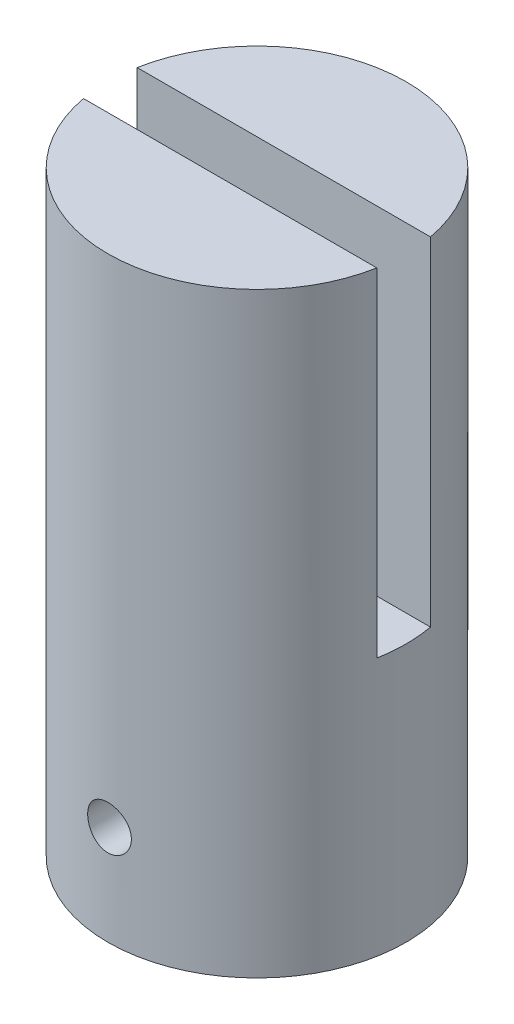
ISO-10303-21;
HEADER;
FILE_DESCRIPTION(('STEP AP214'),'2;1');
FILE_NAME('part.step','',(''),(''),'','','');
FILE_SCHEMA(('AUTOMOTIVE_DESIGN { 1 0 10303 214 1 1 1 1 }'));
ENDSEC;
DATA;
#1=APPLICATION_CONTEXT('core data for automotive mechanical design processes');
#2=APPLICATION_PROTOCOL_DEFINITION('international standard','automotive_design',2000,#1);
#3=PRODUCT_CONTEXT('',#1,'mechanical');
#4=PRODUCT('Part','Part','',(#3));
#5=PRODUCT_RELATED_PRODUCT_CATEGORY('part','',(#4));
#6=PRODUCT_DEFINITION_FORMATION('','',#4);
#7=PRODUCT_DEFINITION_CONTEXT('part definition',#1,'design');
#8=PRODUCT_DEFINITION('design','',#6,#7);
#9=PRODUCT_DEFINITION_SHAPE('','',#8);
#10=(LENGTH_UNIT() NAMED_UNIT(*) SI_UNIT(.MILLI.,.METRE.));
#11=(NAMED_UNIT(*) PLANE_ANGLE_UNIT() SI_UNIT($,.RADIAN.));
#12=(NAMED_UNIT(*) SI_UNIT($,.STERADIAN.) SOLID_ANGLE_UNIT());
#13=UNCERTAINTY_MEASURE_WITH_UNIT(LENGTH_MEASURE(1.E-05),#10,'distance_accuracy_value','');
#14=(GEOMETRIC_REPRESENTATION_CONTEXT(3) GLOBAL_UNCERTAINTY_ASSIGNED_CONTEXT((#13)) GLOBAL_UNIT_ASSIGNED_CONTEXT((#10,
#11,#12)) REPRESENTATION_CONTEXT('',''));
#15=CARTESIAN_POINT('',(0.,0.,0.));
#16=DIRECTION('',(0.,0.,1.));
#17=DIRECTION('',(1.,0.,0.));
#18=AXIS2_PLACEMENT_3D('',#15,#16,#17);
#19=CARTESIAN_POINT('',(0.,20.,0.));
#20=DIRECTION('',(0.,1.,0.));
#21=DIRECTION('',(0.,0.,1.));
#22=AXIS2_PLACEMENT_3D('',#19,#20,#21);
#23=PLANE('',#22);
#24=DIRECTION('',(-1.,0.,0.));
#25=VECTOR('',#24,1.);
#26=CARTESIAN_POINT('',(-7.37749957641476,20.,-1.35));
#27=LINE('',#26,#25);
#28=CARTESIAN_POINT('',(7.37749957641476,20.,-1.35));
#29=VERTEX_POINT('',#28);
#30=CARTESIAN_POINT('',(-7.37749957641476,20.,-1.35));
#31=VERTEX_POINT('',#30);
#32=EDGE_CURVE('E89',#29,#31,#27,.T.);
#33=ORIENTED_EDGE('',*,*,#32,.F.);
#34=CARTESIAN_POINT('',(0.,20.,0.));
#35=DIRECTION('',(0.,1.,0.));
#36=DIRECTION('',(0.,0.,1.));
#37=AXIS2_PLACEMENT_3D('',#34,#35,#36);
#38=CIRCLE('',#37,7.5);
#39=EDGE_CURVE('E138',#29,#31,#38,.T.);
#40=ORIENTED_EDGE('',*,*,#39,.T.);
#41=EDGE_LOOP('',(#33,#40));
#42=FACE_BOUND('',#41,.T.);
#43=ADVANCED_FACE('F45',(#42),#23,.T.);
#44=CARTESIAN_POINT('',(0.,-10.,0.));
#45=DIRECTION('',(0.,1.,0.));
#46=DIRECTION('',(0.,0.,1.));
#47=AXIS2_PLACEMENT_3D('',#44,#45,#46);
#48=CYLINDRICAL_SURFACE('',#47,2.5);
#49=CARTESIAN_POINT('',(0.,-6.1,2.5));
#50=CARTESIAN_POINT('',(0.0586367218408859,-6.09999303754305,2.49999465716921));
#51=CARTESIAN_POINT('',(0.117350039514211,-6.09528424770001,2.49791375617732));
#52=CARTESIAN_POINT('',(0.233099616617565,-6.07662392388924,2.48978963586581));
#53=CARTESIAN_POINT('',(0.290131432410816,-6.06264985599233,2.48373675673411));
#54=CARTESIAN_POINT('',(0.400648928249893,-6.02608721324461,2.46831559920335));
#55=CARTESIAN_POINT('',(0.454146383103754,-6.00352913199039,2.45895906500054));
#56=CARTESIAN_POINT('',(0.55654046054891,-5.95057222224762,2.43782683007672));
#57=CARTESIAN_POINT('',(0.605438183509771,-5.92017527555283,2.42605171009798));
#58=CARTESIAN_POINT('',(0.700001144236969,-5.85065400836642,2.40052408725658));
#59=CARTESIAN_POINT('',(0.745382457137743,-5.81116927213135,2.38670214750626));
#60=CARTESIAN_POINT('',(0.829128369829129,-5.72535787012568,2.35891853478619));
#61=CARTESIAN_POINT('',(0.86748886949951,-5.67902723474457,2.34495678515567));
#62=CARTESIAN_POINT('',(0.938247991654476,-5.57768499315168,2.31758746970848));
#63=CARTESIAN_POINT('',(0.970189247297979,-5.52233146084711,2.30425538414495));
#64=CARTESIAN_POINT('',(1.02418114955138,-5.40637017403964,2.28077315587808));
#65=CARTESIAN_POINT('',(1.0462374610425,-5.34576545272414,2.27062119171201));
#66=CARTESIAN_POINT('',(1.07862747820579,-5.22428751605859,2.25540902073449));
#67=CARTESIAN_POINT('',(1.08951044424758,-5.16359166760425,2.25011178233037));
#68=CARTESIAN_POINT('',(1.10095369826767,-5.04102223082931,2.24453690633814));
#69=CARTESIAN_POINT('',(1.10152067171218,-4.97914943128522,2.24425601781561));
#70=CARTESIAN_POINT('',(1.09272613127389,-4.86176275096281,2.24854737601977));
#71=CARTESIAN_POINT('',(1.08422761243453,-4.80616554013494,2.25269781148248));
#72=CARTESIAN_POINT('',(1.05900347128123,-4.69728584959256,2.26466430921562));
#73=CARTESIAN_POINT('',(1.04227604774947,-4.6440038794393,2.27248117401014));
#74=CARTESIAN_POINT('',(1.00073766420331,-4.53984871594457,2.29108049051599));
#75=CARTESIAN_POINT('',(0.975754853135299,-4.48905567399721,2.30192515424446));
#76=CARTESIAN_POINT('',(0.918538071138383,-4.39217074774947,2.32534772681104));
#77=CARTESIAN_POINT('',(0.88630107487799,-4.34608083656255,2.33792635794357));
#78=CARTESIAN_POINT('',(0.811891845979586,-4.25528801109822,2.36485507398313));
#79=CARTESIAN_POINT('',(0.76906566316889,-4.21113560599842,2.37925975443799));
#80=CARTESIAN_POINT('',(0.676492059688758,-4.13044259291211,2.4072173289364));
#81=CARTESIAN_POINT('',(0.626742634748407,-4.09390419685027,2.42076997466146));
#82=CARTESIAN_POINT('',(0.519896961156606,-4.02853873306688,2.44597634517675));
#83=CARTESIAN_POINT('',(0.462632077104509,-3.99996037893763,2.45756514374559));
#84=CARTESIAN_POINT('',(0.34346659465005,-3.95304061298761,2.4770275389561));
#85=CARTESIAN_POINT('',(0.281568886783102,-3.93469287742953,2.48490343014915));
#86=CARTESIAN_POINT('',(0.159473485006452,-3.90996463944416,2.49560863731161));
#87=CARTESIAN_POINT('',(0.0994523604133099,-3.90284689031869,2.49874819192128));
#88=CARTESIAN_POINT('',(-0.0210050155627028,-3.89855218725717,2.5006363719003));
#89=CARTESIAN_POINT('',(-0.0814411230661712,-3.90137194595955,2.49938644932419));
#90=CARTESIAN_POINT('',(-0.197395564749818,-3.91636745443862,2.49283358306434));
#91=CARTESIAN_POINT('',(-0.252998460268493,-3.92800374945377,2.48776442279183));
#92=CARTESIAN_POINT('',(-0.361388625268707,-3.95952648520691,2.47434485753276));
#93=CARTESIAN_POINT('',(-0.414175549285706,-3.97941393558514,2.46599405099908));
#94=CARTESIAN_POINT('',(-0.517306134249112,-4.02751180281109,2.44647422999304));
#95=CARTESIAN_POINT('',(-0.567521975819027,-4.05596278950484,2.43522533453316));
#96=CARTESIAN_POINT('',(-0.662647931848933,-4.12011780412387,2.41108068156595));
#97=CARTESIAN_POINT('',(-0.70755573255054,-4.15582497669157,2.39818421094523));
#98=CARTESIAN_POINT('',(-0.794535921084732,-4.23677307617851,2.37085476506779));
#99=CARTESIAN_POINT('',(-0.836102677071006,-4.28254485504362,2.3563809618822));
#100=CARTESIAN_POINT('',(-0.911130364291372,-4.38060186209504,2.32840043164694));
#101=CARTESIAN_POINT('',(-0.944588603277077,-4.43288924493781,2.31489402684557));
#102=CARTESIAN_POINT('',(-1.00306461500776,-4.54405227248348,2.29017357162823));
#103=CARTESIAN_POINT('',(-1.02788184272011,-4.60304697145719,2.27901610024637));
#104=CARTESIAN_POINT('',(-1.0669970798892,-4.72502869073128,2.26097093531371));
#105=CARTESIAN_POINT('',(-1.08130511881295,-4.78801184211108,2.25407917176632));
#106=CARTESIAN_POINT('',(-1.09794749998744,-4.91051377364932,2.24601624579395));
#107=CARTESIAN_POINT('',(-1.10118265331803,-4.96988212983158,2.24441509875159));
#108=CARTESIAN_POINT('',(-1.09804797544474,-5.08829554931592,2.24595065931745));
#109=CARTESIAN_POINT('',(-1.09168008522386,-5.14734067552901,2.24908640949641));
#110=CARTESIAN_POINT('',(-1.0703038985897,-5.25988942044146,2.2593308804113));
#111=CARTESIAN_POINT('',(-1.0558164292123,-5.31351605911872,2.26619942385352));
#112=CARTESIAN_POINT('',(-1.01915514976327,-5.41757418673947,2.2829205949874));
#113=CARTESIAN_POINT('',(-0.996979128423342,-5.46800475153443,2.29277408106133));
#114=CARTESIAN_POINT('',(-0.943956611645528,-5.56774649245633,2.31512904717081));
#115=CARTESIAN_POINT('',(-0.912648777587145,-5.61678300376447,2.32775898670394));
#116=CARTESIAN_POINT('',(-0.842858154954993,-5.70918660820952,2.35392825284202));
#117=CARTESIAN_POINT('',(-0.804372446896091,-5.75255138220496,2.36746794803684));
#118=CARTESIAN_POINT('',(-0.717447247329579,-5.83618671892077,2.39531255770243));
#119=CARTESIAN_POINT('',(-0.668439664484218,-5.87588072076266,2.40958465591957));
#120=CARTESIAN_POINT('',(-0.563953859058426,-5.94653695946252,2.4361563814722));
#121=CARTESIAN_POINT('',(-0.508472708062032,-5.97749522276229,2.44845511010259));
#122=CARTESIAN_POINT('',(-0.393174205565595,-6.0292517525901,2.46957634083649));
#123=CARTESIAN_POINT('',(-0.333418590724998,-6.05017031601379,2.47843974411015));
#124=CARTESIAN_POINT('',(-0.210859953188953,-6.08143963656917,2.49184807766586));
#125=CARTESIAN_POINT('',(-0.148066893788328,-6.09182277592608,2.49640623776158));
#126=CARTESIAN_POINT('',(-0.0566361036605752,-6.09890941998446,2.49952077080228));
#127=CARTESIAN_POINT('',(-0.0283269897537342,-6.1000033635142,2.50000258108415));
#128=CARTESIAN_POINT('',(0.,-6.1,2.5));
#129=B_SPLINE_CURVE_WITH_KNOTS('',3,(#49,#50,#51,#52,#53,#54,#55,#56,#57,#58,#59,#60,#61,#62,
#63,#64,#65,#66,#67,#68,#69,#70,#71,#72,#73,#74,#75,#76,#77,#78,#79,#80,#81,#82,#83,#84,#85,#86,
#87,#88,#89,#90,#91,#92,#93,#94,#95,#96,#97,#98,#99,#100,#101,#102,#103,#104,#105,#106,#107,
#108,#109,#110,#111,#112,#113,#114,#115,#116,#117,#118,#119,#120,#121,#122,#123,#124,#125,#126,
#127,#128),.UNSPECIFIED.,.T.,.F.,(4,2,2,2,2,2,2,2,2,2,2,2,2,2,2,2,2,2,2,2,2,2,2,2,2,2,2,2,2,2,2,
2,2,2,2,2,2,2,2,4),(0.,0.175823006765325,0.352075206033633,0.52770705040205,0.703296771869916,
0.887667196439057,1.07214495123452,1.26701099730957,1.46176522595861,1.64640617200027,
1.83092745386095,1.99932953094852,2.16776848583312,2.33996148471304,2.51222642958632,
2.70090374625017,2.88963579885964,3.08373249775163,3.27770908845655,3.45832470157031,
3.63888057203061,3.80920070013579,3.97954167535736,4.1552033636875,4.33094134220297,
4.52058675503902,4.71029504931062,4.90415128828871,5.09782227890324,5.27530624846021,
5.45275434947241,5.61994334896612,5.78718047284463,5.96504237618469,6.1429767803923,
6.33603973003759,6.5291903557019,6.71996496949548,6.91015141588824,6.99509027936405),.UNSPECIFIED.);
#130=CARTESIAN_POINT('',(0.,-6.1,2.5));
#131=VERTEX_POINT('',#130);
#132=EDGE_CURVE('E126',#131,#131,#129,.T.);
#133=ORIENTED_EDGE('',*,*,#132,.T.);
#134=EDGE_LOOP('',(#133));
#135=FACE_BOUND('',#134,.T.);
#136=CARTESIAN_POINT('',(1.1,-5.,-2.24499443206436));
#137=CARTESIAN_POINT('',(1.09999264071967,-5.05832534530599,-2.24500186891575));
#138=CARTESIAN_POINT('',(1.09533182245849,-5.11673095665704,-2.2473008014463));
#139=CARTESIAN_POINT('',(1.07687935781384,-5.2318356309388,-2.2561976772502));
#140=CARTESIAN_POINT('',(1.06306428213531,-5.2885299236318,-2.26280665090222));
#141=CARTESIAN_POINT('',(1.02696546928901,-5.39832938440307,-2.27941479604708));
#142=CARTESIAN_POINT('',(1.00471896027897,-5.45144913852327,-2.28939904371374));
#143=CARTESIAN_POINT('',(0.952498974806719,-5.55318908175269,-2.31161149325762));
#144=CARTESIAN_POINT('',(0.922526710535582,-5.60180997511992,-2.32383934302118));
#145=CARTESIAN_POINT('',(0.853478204326694,-5.69658108301255,-2.35011094846474));
#146=CARTESIAN_POINT('',(0.813946593299058,-5.74238141024933,-2.36422061386325));
#147=CARTESIAN_POINT('',(0.727855362180884,-5.82696454630179,-2.39212743157456));
#148=CARTESIAN_POINT('',(0.681292858785606,-5.86574446169749,-2.40592445299291));
#149=CARTESIAN_POINT('',(0.579643227927882,-5.93704472624726,-2.43246847746696));
#150=CARTESIAN_POINT('',(0.524248796898383,-5.96916168762396,-2.44513005272046));
#151=CARTESIAN_POINT('',(0.408184216492102,-6.02346689815691,-2.46715746778218));
#152=CARTESIAN_POINT('',(0.347516683060515,-6.04566003724484,-2.47652493026685));
#153=CARTESIAN_POINT('',(0.226310849545847,-6.07818921438298,-2.49043942220434));
#154=CARTESIAN_POINT('',(0.165963932126523,-6.08913124957504,-2.49523168581752));
#155=CARTESIAN_POINT('',(0.0441134537254011,-6.10081566660431,-2.5003531145501));
#156=CARTESIAN_POINT('',(-0.0173895674937781,-6.10156269539892,-2.50068431305423));
#157=CARTESIAN_POINT('',(-0.135361763608586,-6.09313174808474,-2.49698346578356));
#158=CARTESIAN_POINT('',(-0.191889766863561,-6.0846225000889,-2.49324539438955));
#159=CARTESIAN_POINT('',(-0.302619645234444,-6.05908000760638,-2.48224055592851));
#160=CARTESIAN_POINT('',(-0.356821347840335,-6.04204613214601,-2.47497352765724));
#161=CARTESIAN_POINT('',(-0.462364843718385,-5.99975081585187,-2.4574634692465));
#162=CARTESIAN_POINT('',(-0.513650307195615,-5.97436767675258,-2.44717667746158));
#163=CARTESIAN_POINT('',(-0.611368753826889,-5.91622273749278,-2.42461273867786));
#164=CARTESIAN_POINT('',(-0.657799964862745,-5.88345825633757,-2.41233486895002));
#165=CARTESIAN_POINT('',(-0.748309969403563,-5.80854467466483,-2.3858801337429));
#166=CARTESIAN_POINT('',(-0.791929518202139,-5.7658659371704,-2.37162983972768));
#167=CARTESIAN_POINT('',(-0.871604932828498,-5.67380525175017,-2.34352160386143));
#168=CARTESIAN_POINT('',(-0.907657178035842,-5.62442011363417,-2.32966385255521));
#169=CARTESIAN_POINT('',(-0.972551863960967,-5.51786697337761,-2.30334986356432));
#170=CARTESIAN_POINT('',(-1.00104660738835,-5.4604660589339,-2.29097226218579));
#171=CARTESIAN_POINT('',(-1.0477731426051,-5.34099363699715,-2.2699857105531));
#172=CARTESIAN_POINT('',(-1.06601324561569,-5.27892595823709,-2.26137370960231));
#173=CARTESIAN_POINT('',(-1.09047181528063,-5.15649635690884,-2.24967637482319));
#174=CARTESIAN_POINT('',(-1.09744082962861,-5.09631799210515,-2.24624709890656));
#175=CARTESIAN_POINT('',(-1.10138444364863,-4.97556678141091,-2.24431716581293));
#176=CARTESIAN_POINT('',(-1.09836322284601,-4.9149941110651,-2.24581444755476));
#177=CARTESIAN_POINT('',(-1.08309883991271,-4.79997445108104,-2.2532104139799));
#178=CARTESIAN_POINT('',(-1.07156417098469,-4.74540871176996,-2.25877064140546));
#179=CARTESIAN_POINT('',(-1.04056836908943,-4.63904589266692,-2.2732152516958));
#180=CARTESIAN_POINT('',(-1.02110523508159,-4.58724951556178,-2.28210047369949));
#181=CARTESIAN_POINT('',(-0.973855802064503,-4.48531502410598,-2.30267121517148));
#182=CARTESIAN_POINT('',(-0.945738180525618,-4.43535278150715,-2.31446359544008));
#183=CARTESIAN_POINT('',(-0.88229515910368,-4.34059897112326,-2.33938364186295));
#184=CARTESIAN_POINT('',(-0.846966407868071,-4.29580982272973,-2.35251192744771));
#185=CARTESIAN_POINT('',(-0.766250940130195,-4.20834348326937,-2.38009237517463));
#186=CARTESIAN_POINT('',(-0.720235306799715,-4.16624735384173,-2.39455440317886));
#187=CARTESIAN_POINT('',(-0.621478409089594,-4.09024918917781,-2.42206311373892));
#188=CARTESIAN_POINT('',(-0.568736277320656,-4.0563482123507,-2.43510961335855));
#189=CARTESIAN_POINT('',(-0.457328840448396,-3.9975812463636,-2.45847705567111));
#190=CARTESIAN_POINT('',(-0.398622234619679,-3.972784635954,-2.46877691176735));
#191=CARTESIAN_POINT('',(-0.277295435121193,-3.93362148928049,-2.48532596548122));
#192=CARTESIAN_POINT('',(-0.214677899404982,-3.91924795126829,-2.49157788201844));
#193=CARTESIAN_POINT('',(-0.0924681222925543,-3.90229273779352,-2.49898163891922));
#194=CARTESIAN_POINT('',(-0.0330099164450834,-3.89889454314046,-2.50048642500148));
#195=CARTESIAN_POINT('',(0.0856232403929806,-3.90173467433723,-2.49923675127029));
#196=CARTESIAN_POINT('',(0.144798249098678,-3.9079709447969,-2.49648319991867));
#197=CARTESIAN_POINT('',(0.258552884051377,-3.92931917911344,-2.48722160837499));
#198=CARTESIAN_POINT('',(0.313220762920489,-3.9440392317527,-2.48087956206805));
#199=CARTESIAN_POINT('',(0.419273041124582,-3.98148424929485,-2.46517470655145));
#200=CARTESIAN_POINT('',(0.470656854374071,-4.0042106383491,-2.45581135994377));
#201=CARTESIAN_POINT('',(0.571286976441056,-4.0581723526588,-2.43441956507932));
#202=CARTESIAN_POINT('',(0.620327472114033,-4.08974983811884,-2.42228866159088));
#203=CARTESIAN_POINT('',(0.71262843809811,-4.16004201887515,-2.39675984874361));
#204=CARTESIAN_POINT('',(0.755886490574643,-4.19875968371979,-2.38336141336083));
#205=CARTESIAN_POINT('',(0.838875102840799,-4.28573536284001,-2.35549351893128));
#206=CARTESIAN_POINT('',(0.878076999318062,-4.33449862675056,-2.34102108586691));
#207=CARTESIAN_POINT('',(0.947850118274262,-4.43831346571325,-2.31365292914796));
#208=CARTESIAN_POINT('',(0.978416065426935,-4.49336885563961,-2.30075817194161));
#209=CARTESIAN_POINT('',(1.02994457246076,-4.60858461437734,-2.27815955688964));
#210=CARTESIAN_POINT('',(1.05088627507499,-4.66875573874873,-2.26846264199146));
#211=CARTESIAN_POINT('',(1.08206209910023,-4.79223462376859,-2.25376370647696));
#212=CARTESIAN_POINT('',(1.09233214658097,-4.85553110398974,-2.24874593942601));
#213=CARTESIAN_POINT('',(1.09901270586322,-4.94610163272641,-2.24547707915797));
#214=CARTESIAN_POINT('',(1.10000340143192,-4.97304224293052,-2.24499099477939));
#215=CARTESIAN_POINT('',(1.1,-5.,-2.24499443206436));
#216=B_SPLINE_CURVE_WITH_KNOTS('',3,(#136,#137,#138,#139,#140,#141,#142,#143,#144,#145,#146,
#147,#148,#149,#150,#151,#152,#153,#154,#155,#156,#157,#158,#159,#160,#161,#162,#163,#164,#165,
#166,#167,#168,#169,#170,#171,#172,#173,#174,#175,#176,#177,#178,#179,#180,#181,#182,#183,#184,
#185,#186,#187,#188,#189,#190,#191,#192,#193,#194,#195,#196,#197,#198,#199,#200,#201,#202,#203,
#204,#205,#206,#207,#208,#209,#210,#211,#212,#213,#214,#215),.UNSPECIFIED.,.T.,.F.,(4,2,2,2,2,2,
2,2,2,2,2,2,2,2,2,2,2,2,2,2,2,2,2,2,2,2,2,2,2,2,2,2,2,2,2,2,2,2,2,4),(0.,0.174891994667566,
0.350233343674121,0.524809343440101,0.699357968434042,0.884928681651847,1.07057570344715,
1.26538500767087,1.46009821416859,1.64366581372382,1.82714973904773,1.99820752306006,
2.16927797025682,2.34296144404577,2.51670810381827,2.70388470367642,2.89115065615067,
3.08593731227328,3.28056586850662,3.46160310705007,3.64256461624719,3.80995675731,
3.97739117215506,4.1522633019623,4.32721688891383,4.51839534153399,4.70959847179734,
4.90222980302486,5.09473161306757,5.27253594053548,5.45030234095709,5.62044885932699,
5.79062565831863,5.96859980397145,6.14664813538065,6.33841613542975,6.53030102619201,
6.722599823464,6.91424912960411,6.99508355726004),.UNSPECIFIED.);
#217=CARTESIAN_POINT('',(1.1,-5.,-2.24499443206436));
#218=VERTEX_POINT('',#217);
#219=EDGE_CURVE('E169',#218,#218,#216,.T.);
#220=ORIENTED_EDGE('',*,*,#219,.T.);
#221=EDGE_LOOP('',(#220));
#222=FACE_BOUND('',#221,.T.);
#223=CARTESIAN_POINT('',(0.,-10.,0.));
#224=DIRECTION('',(0.,1.,0.));
#225=DIRECTION('',(0.,0.,1.));
#226=AXIS2_PLACEMENT_3D('',#223,#224,#225);
#227=CIRCLE('',#226,2.5);
#228=CARTESIAN_POINT('',(0.,-10.,2.5));
#229=VERTEX_POINT('',#228);
#230=EDGE_CURVE('E139',#229,#229,#227,.T.);
#231=ORIENTED_EDGE('',*,*,#230,.F.);
#232=EDGE_LOOP('',(#231));
#233=FACE_BOUND('',#232,.T.);
#234=CARTESIAN_POINT('',(0.,0.,0.));
#235=DIRECTION('',(0.,1.,0.));
#236=DIRECTION('',(0.,0.,1.));
#237=AXIS2_PLACEMENT_3D('',#234,#235,#236);
#238=CIRCLE('',#237,2.5);
#239=CARTESIAN_POINT('',(0.,0.,2.5));
#240=VERTEX_POINT('',#239);
#241=EDGE_CURVE('E144',#240,#240,#238,.T.);
#242=ORIENTED_EDGE('',*,*,#241,.T.);
#243=EDGE_LOOP('',(#242));
#244=FACE_BOUND('',#243,.T.);
#245=ADVANCED_FACE('F47',(#135,#222,#233,#244),#48,.F.);
#246=CARTESIAN_POINT('',(0.,-10.,0.));
#247=DIRECTION('',(0.,1.,0.));
#248=DIRECTION('',(0.,0.,1.));
#249=AXIS2_PLACEMENT_3D('',#246,#247,#248);
#250=CYLINDRICAL_SURFACE('',#249,7.5);
#251=CARTESIAN_POINT('',(0.,-3.9,-7.5));
#252=CARTESIAN_POINT('',(0.0614339137792254,-3.90000254549349,-7.49999903078676));
#253=CARTESIAN_POINT('',(0.122903869751573,-3.90516390668222,-7.49923725541577));
#254=CARTESIAN_POINT('',(0.244126707027792,-3.92566838042423,-7.49627169143623));
#255=CARTESIAN_POINT('',(0.303877838643947,-3.94102150996431,-7.49406648417941));
#256=CARTESIAN_POINT('',(0.419891057921686,-3.98144182653872,-7.48846196014082));
#257=CARTESIAN_POINT('',(0.476155705499526,-4.00650178600017,-7.48506353199072));
#258=CARTESIAN_POINT('',(0.583672318702268,-4.06560699327752,-7.47744844153889));
#259=CARTESIAN_POINT('',(0.63492500236734,-4.09965095140642,-7.47323189670389));
#260=CARTESIAN_POINT('',(0.731355183041635,-4.17602929289263,-7.46441445772028));
#261=CARTESIAN_POINT('',(0.776489749189182,-4.21841760855832,-7.45981118128225));
#262=CARTESIAN_POINT('',(0.859032180642691,-4.31016538152651,-7.45075782263986));
#263=CARTESIAN_POINT('',(0.8964396091892,-4.35952523261435,-7.4463077491068));
#264=CARTESIAN_POINT('',(0.962632049862312,-4.46410210237275,-7.43804150204043));
#265=CARTESIAN_POINT('',(0.991375704507371,-4.51934556285402,-7.43422840657554));
#266=CARTESIAN_POINT('',(1.03916040032448,-4.6339413056616,-7.4277002412086));
#267=CARTESIAN_POINT('',(1.05820194689178,-4.69329337378228,-7.42498511411349));
#268=CARTESIAN_POINT('',(1.08590896566669,-4.81397080126806,-7.42098364429715));
#269=CARTESIAN_POINT('',(1.09464780616288,-4.87527897467988,-7.41968720355019));
#270=CARTESIAN_POINT('',(1.10172860035277,-4.99850422396054,-7.4186392078154));
#271=CARTESIAN_POINT('',(1.10007112514448,-5.060421266196,-7.41888756796745));
#272=CARTESIAN_POINT('',(1.08646633340055,-5.18258938077591,-7.42089187683157));
#273=CARTESIAN_POINT('',(1.074600601277,-5.24284976276574,-7.42263587207579));
#274=CARTESIAN_POINT('',(1.0410437721177,-5.36051487436565,-7.42741627905539));
#275=CARTESIAN_POINT('',(1.01935240833592,-5.41791952640148,-7.43045272587809));
#276=CARTESIAN_POINT('',(0.9666747959219,-5.52849264509925,-7.43748916017096));
#277=CARTESIAN_POINT('',(0.935653862230755,-5.58164435018106,-7.44149273205095));
#278=CARTESIAN_POINT('',(0.865222397580546,-5.68201885530944,-7.45000970051316));
#279=CARTESIAN_POINT('',(0.825811339856102,-5.72924128279628,-7.45452312909787));
#280=CARTESIAN_POINT('',(0.739269913176589,-5.81688969773502,-7.46360412460752));
#281=CARTESIAN_POINT('',(0.692069374554426,-5.85724642305706,-7.468171796712));
#282=CARTESIAN_POINT('',(0.59152834177619,-5.92947596797951,-7.47680652057131));
#283=CARTESIAN_POINT('',(0.538187822827545,-5.96134875332097,-7.48087357030453));
#284=CARTESIAN_POINT('',(0.426821886355061,-6.01570872231936,-7.48805278591713));
#285=CARTESIAN_POINT('',(0.368793894772149,-6.03819070676104,-7.49116442258036));
#286=CARTESIAN_POINT('',(0.249730300005073,-6.07307143246982,-7.49607774605898));
#287=CARTESIAN_POINT('',(0.18869489140167,-6.08547082517737,-7.49787951750451));
#288=CARTESIAN_POINT('',(0.0659469706202572,-6.09974262923242,-7.49995892171531));
#289=CARTESIAN_POINT('',(0.0042457578093759,-6.10171028893742,-7.50025034437375));
#290=CARTESIAN_POINT('',(-0.118605719627989,-6.09531538208784,-7.49931370926277));
#291=CARTESIAN_POINT('',(-0.179756000485778,-6.08695312087777,-7.4980856964067));
#292=CARTESIAN_POINT('',(-0.299482343134792,-6.06021494109972,-7.49425670440967));
#293=CARTESIAN_POINT('',(-0.358068956985494,-6.0418852853352,-7.49166207005829));
#294=CARTESIAN_POINT('',(-0.471337351522008,-5.99578131532552,-7.4853898820589));
#295=CARTESIAN_POINT('',(-0.526018955716097,-5.96800657452457,-7.48171227950325));
#296=CARTESIAN_POINT('',(-0.630344895974966,-5.90357639841735,-7.47364872669928));
#297=CARTESIAN_POINT('',(-0.679951436879122,-5.86686037164079,-7.4692580146524));
#298=CARTESIAN_POINT('',(-0.772332556824691,-5.78567440913556,-7.46027215892464));
#299=CARTESIAN_POINT('',(-0.815106756906359,-5.74120404359393,-7.45567700392226));
#300=CARTESIAN_POINT('',(-0.89295433674454,-5.64534834716264,-7.44675660483446));
#301=CARTESIAN_POINT('',(-0.927963966645664,-5.59391098267122,-7.44243378980161));
#302=CARTESIAN_POINT('',(-0.988845883817523,-5.48582972563999,-7.43459010616074));
#303=CARTESIAN_POINT('',(-1.01471840934016,-5.42918596890649,-7.43106921664319));
#304=CARTESIAN_POINT('',(-1.05649225011172,-5.31249216275356,-7.42524548075169));
#305=CARTESIAN_POINT('',(-1.07242745544987,-5.25245446070129,-7.42293849873847));
#306=CARTESIAN_POINT('',(-1.09398237497283,-5.13051870640119,-7.41979266689479));
#307=CARTESIAN_POINT('',(-1.09960276755589,-5.06862077677145,-7.41895372051277));
#308=CARTESIAN_POINT('',(-1.10035290779075,-4.94535684661601,-7.41884244449659));
#309=CARTESIAN_POINT('',(-1.0955828767175,-4.88399144592204,-7.4195551483194));
#310=CARTESIAN_POINT('',(-1.07590197796449,-4.76294549188111,-7.42243439260507));
#311=CARTESIAN_POINT('',(-1.06099112373807,-4.70326493629907,-7.42460093113919));
#312=CARTESIAN_POINT('',(-1.02148671040963,-4.58730848428274,-7.43013858440607));
#313=CARTESIAN_POINT('',(-0.996899848024538,-4.53103026411966,-7.43350886588553));
#314=CARTESIAN_POINT('',(-0.938751285001512,-4.42338153240762,-7.44107531977226));
#315=CARTESIAN_POINT('',(-0.905189307493384,-4.37201117232589,-7.44527151765687));
#316=CARTESIAN_POINT('',(-0.829677941083677,-4.27512669624521,-7.45406523526029));
#317=CARTESIAN_POINT('',(-0.787654244466669,-4.22967079186304,-7.45866609131538));
#318=CARTESIAN_POINT('',(-0.696569291934378,-4.14642019159302,-7.46772263777699));
#319=CARTESIAN_POINT('',(-0.647506399685664,-4.10862728199045,-7.47217829413399));
#320=CARTESIAN_POINT('',(-0.543433518566299,-4.0415991568414,-7.4804690354185));
#321=CARTESIAN_POINT('',(-0.488393657059063,-4.012409915266,-7.48430073920828));
#322=CARTESIAN_POINT('',(-0.37416307280373,-3.96373339505319,-7.49087858915199));
#323=CARTESIAN_POINT('',(-0.314976753586265,-3.94423599668696,-7.49362586698822));
#324=CARTESIAN_POINT('',(-0.212932358081482,-3.91995514332138,-7.49709312323017));
#325=CARTESIAN_POINT('',(-0.170706280118833,-3.9124833013654,-7.49817764536712));
#326=CARTESIAN_POINT('',(-0.0856593052075394,-3.90250487105526,-7.4996314175168));
#327=CARTESIAN_POINT('',(-0.0428384151765292,-3.89999822500472,-7.50000067584102));
#328=CARTESIAN_POINT('',(0.,-3.9,-7.5));
#329=B_SPLINE_CURVE_WITH_KNOTS('',3,(#251,#252,#253,#254,#255,#256,#257,#258,#259,#260,#261,
#262,#263,#264,#265,#266,#267,#268,#269,#270,#271,#272,#273,#274,#275,#276,#277,#278,#279,#280,
#281,#282,#283,#284,#285,#286,#287,#288,#289,#290,#291,#292,#293,#294,#295,#296,#297,#298,#299,
#300,#301,#302,#303,#304,#305,#306,#307,#308,#309,#310,#311,#312,#313,#314,#315,#316,#317,#318,
#319,#320,#321,#322,#323,#324,#325,#326,#327,#328),.UNSPECIFIED.,.T.,.F.,(4,2,2,2,2,2,2,2,2,2,2,
2,2,2,2,2,2,2,2,2,2,2,2,2,2,2,2,2,2,2,2,2,2,2,2,2,2,2,4),(0.,0.184145214135645,
0.368471684025478,0.552661169958333,0.736824229163183,0.922219175599117,1.10762459821091,
1.29390154601941,1.48016878943053,1.66510140488703,1.85002386157894,2.03348200306703,
2.21694512537133,2.40109893203312,2.58526430401544,2.77118963521338,2.95711571718387,
3.14314460109183,3.32916146464068,3.51347691345021,3.69778691416735,3.88124866815049,
4.0647187086728,4.24946845023511,4.4342284354933,4.62045340203654,4.80667351236636,
4.99225501652602,5.17782431467818,5.36161162819954,5.54539869789972,5.72905879255057,
5.91272455352131,6.09807966640001,6.28347793700445,6.46984963984061,6.65602633191713,
6.78443392176047,6.91284001947813),.UNSPECIFIED.);
#330=CARTESIAN_POINT('',(0.,-3.9,-7.5));
#331=VERTEX_POINT('',#330);
#332=EDGE_CURVE('E11',#331,#331,#329,.T.);
#333=ORIENTED_EDGE('',*,*,#332,.F.);
#334=EDGE_LOOP('',(#333));
#335=FACE_BOUND('',#334,.T.);
#336=CARTESIAN_POINT('',(0.,-6.1,7.5));
#337=CARTESIAN_POINT('',(0.0614339137792254,-6.09999745450651,7.49999903078676));
#338=CARTESIAN_POINT('',(0.122903869751573,-6.09483609331779,7.49923725541577));
#339=CARTESIAN_POINT('',(0.244126707027792,-6.07433161957577,7.49627169143623));
#340=CARTESIAN_POINT('',(0.303877838643947,-6.05897849003569,7.49406648417941));
#341=CARTESIAN_POINT('',(0.419891057921686,-6.01855817346128,7.48846196014082));
#342=CARTESIAN_POINT('',(0.476155705499526,-5.99349821399983,7.48506353199072));
#343=CARTESIAN_POINT('',(0.583672318702268,-5.93439300672248,7.47744844153889));
#344=CARTESIAN_POINT('',(0.63492500236734,-5.90034904859358,7.47323189670389));
#345=CARTESIAN_POINT('',(0.731355183041635,-5.82397070710737,7.46441445772028));
#346=CARTESIAN_POINT('',(0.776489749189181,-5.78158239144168,7.45981118128225));
#347=CARTESIAN_POINT('',(0.85903218064269,-5.6898346184735,7.45075782263986));
#348=CARTESIAN_POINT('',(0.896439609189199,-5.64047476738565,7.4463077491068));
#349=CARTESIAN_POINT('',(0.962632049862312,-5.53589789762726,7.43804150204043));
#350=CARTESIAN_POINT('',(0.991375704507371,-5.48065443714598,7.43422840657554));
#351=CARTESIAN_POINT('',(1.03916040032448,-5.3660586943384,7.4277002412086));
#352=CARTESIAN_POINT('',(1.05820194689179,-5.30670662621772,7.42498511411349));
#353=CARTESIAN_POINT('',(1.08590896566669,-5.18602919873194,7.42098364429715));
#354=CARTESIAN_POINT('',(1.09464780616288,-5.12472102532012,7.41968720355019));
#355=CARTESIAN_POINT('',(1.10172860035277,-5.00149577603946,7.4186392078154));
#356=CARTESIAN_POINT('',(1.10007112514448,-4.939578733804,7.41888756796745));
#357=CARTESIAN_POINT('',(1.08646633340055,-4.81741061922409,7.42089187683157));
#358=CARTESIAN_POINT('',(1.074600601277,-4.75715023723427,7.42263587207579));
#359=CARTESIAN_POINT('',(1.0410437721177,-4.63948512563435,7.42741627905539));
#360=CARTESIAN_POINT('',(1.01935240833592,-4.58208047359852,7.43045272587809));
#361=CARTESIAN_POINT('',(0.9666747959219,-4.47150735490076,7.43748916017096));
#362=CARTESIAN_POINT('',(0.935653862230755,-4.41835564981894,7.44149273205095));
#363=CARTESIAN_POINT('',(0.865222397580546,-4.31798114469056,7.45000970051316));
#364=CARTESIAN_POINT('',(0.825811339856102,-4.27075871720372,7.45452312909787));
#365=CARTESIAN_POINT('',(0.739269913176589,-4.18311030226498,7.46360412460752));
#366=CARTESIAN_POINT('',(0.692069374554426,-4.14275357694294,7.468171796712));
#367=CARTESIAN_POINT('',(0.591528341776189,-4.07052403202049,7.47680652057131));
#368=CARTESIAN_POINT('',(0.538187822827545,-4.03865124667903,7.48087357030453));
#369=CARTESIAN_POINT('',(0.426821886355061,-3.98429127768064,7.48805278591713));
#370=CARTESIAN_POINT('',(0.368793894772149,-3.96180929323896,7.49116442258036));
#371=CARTESIAN_POINT('',(0.249730300005073,-3.92692856753019,7.49607774605898));
#372=CARTESIAN_POINT('',(0.18869489140167,-3.91452917482264,7.49787951750451));
#373=CARTESIAN_POINT('',(0.0659469706202573,-3.90025737076758,7.49995892171531));
#374=CARTESIAN_POINT('',(0.00424575780937592,-3.89828971106258,7.50025034437375));
#375=CARTESIAN_POINT('',(-0.118605719627989,-3.90468461791216,7.49931370926277));
#376=CARTESIAN_POINT('',(-0.179756000485778,-3.91304687912223,7.4980856964067));
#377=CARTESIAN_POINT('',(-0.299482343134793,-3.93978505890028,7.49425670440967));
#378=CARTESIAN_POINT('',(-0.358068956985494,-3.9581147146648,7.49166207005829));
#379=CARTESIAN_POINT('',(-0.471337351522008,-4.00421868467448,7.4853898820589));
#380=CARTESIAN_POINT('',(-0.526018955716097,-4.03199342547543,7.48171227950325));
#381=CARTESIAN_POINT('',(-0.630344895974966,-4.09642360158265,7.47364872669928));
#382=CARTESIAN_POINT('',(-0.679951436879122,-4.13313962835921,7.4692580146524));
#383=CARTESIAN_POINT('',(-0.772332556824691,-4.21432559086444,7.46027215892464));
#384=CARTESIAN_POINT('',(-0.815106756906359,-4.25879595640607,7.45567700392226));
#385=CARTESIAN_POINT('',(-0.89295433674454,-4.35465165283736,7.44675660483446));
#386=CARTESIAN_POINT('',(-0.927963966645664,-4.40608901732878,7.44243378980161));
#387=CARTESIAN_POINT('',(-0.988845883817523,-4.51417027436001,7.43459010616074));
#388=CARTESIAN_POINT('',(-1.01471840934016,-4.57081403109351,7.43106921664319));
#389=CARTESIAN_POINT('',(-1.05649225011172,-4.68750783724644,7.42524548075169));
#390=CARTESIAN_POINT('',(-1.07242745544987,-4.74754553929871,7.42293849873847));
#391=CARTESIAN_POINT('',(-1.09398237497283,-4.86948129359881,7.41979266689479));
#392=CARTESIAN_POINT('',(-1.09960276755589,-4.93137922322855,7.41895372051277));
#393=CARTESIAN_POINT('',(-1.10035290779075,-5.05464315338399,7.41884244449659));
#394=CARTESIAN_POINT('',(-1.0955828767175,-5.11600855407796,7.4195551483194));
#395=CARTESIAN_POINT('',(-1.07590197796449,-5.23705450811889,7.42243439260507));
#396=CARTESIAN_POINT('',(-1.06099112373807,-5.29673506370093,7.42460093113919));
#397=CARTESIAN_POINT('',(-1.02148671040963,-5.41269151571726,7.43013858440607));
#398=CARTESIAN_POINT('',(-0.996899848024538,-5.46896973588034,7.43350886588553));
#399=CARTESIAN_POINT('',(-0.938751285001512,-5.57661846759238,7.44107531977226));
#400=CARTESIAN_POINT('',(-0.905189307493384,-5.62798882767412,7.44527151765687));
#401=CARTESIAN_POINT('',(-0.829677941083677,-5.7248733037548,7.45406523526029));
#402=CARTESIAN_POINT('',(-0.787654244466668,-5.77032920813697,7.45866609131538));
#403=CARTESIAN_POINT('',(-0.696569291934377,-5.85357980840698,7.46772263777699));
#404=CARTESIAN_POINT('',(-0.647506399685664,-5.89137271800955,7.47217829413399));
#405=CARTESIAN_POINT('',(-0.543433518566299,-5.9584008431586,7.4804690354185));
#406=CARTESIAN_POINT('',(-0.488393657059064,-5.987590084734,7.48430073920828));
#407=CARTESIAN_POINT('',(-0.374163072803731,-6.03626660494681,7.49087858915199));
#408=CARTESIAN_POINT('',(-0.314976753586265,-6.05576400331304,7.49362586698822));
#409=CARTESIAN_POINT('',(-0.212932358081482,-6.08004485667862,7.49709312323017));
#410=CARTESIAN_POINT('',(-0.170706280118833,-6.0875166986346,7.49817764536712));
#411=CARTESIAN_POINT('',(-0.085659305207539,-6.09749512894474,7.4996314175168));
#412=CARTESIAN_POINT('',(-0.042838415176529,-6.10000177499528,7.50000067584102));
#413=CARTESIAN_POINT('',(0.,-6.1,7.5));
#414=B_SPLINE_CURVE_WITH_KNOTS('',3,(#336,#337,#338,#339,#340,#341,#342,#343,#344,#345,#346,
#347,#348,#349,#350,#351,#352,#353,#354,#355,#356,#357,#358,#359,#360,#361,#362,#363,#364,#365,
#366,#367,#368,#369,#370,#371,#372,#373,#374,#375,#376,#377,#378,#379,#380,#381,#382,#383,#384,
#385,#386,#387,#388,#389,#390,#391,#392,#393,#394,#395,#396,#397,#398,#399,#400,#401,#402,#403,
#404,#405,#406,#407,#408,#409,#410,#411,#412,#413),.UNSPECIFIED.,.T.,.F.,(4,2,2,2,2,2,2,2,2,2,2,
2,2,2,2,2,2,2,2,2,2,2,2,2,2,2,2,2,2,2,2,2,2,2,2,2,2,2,4),(0.,0.184145214135645,
0.368471684025478,0.552661169958333,0.736824229163183,0.922219175599117,1.10762459821091,
1.29390154601942,1.48016878943053,1.66510140488703,1.85002386157894,2.03348200306703,
2.21694512537133,2.40109893203312,2.58526430401544,2.77118963521338,2.95711571718387,
3.14314460109183,3.32916146464068,3.51347691345021,3.69778691416735,3.88124866815049,
4.0647187086728,4.24946845023511,4.4342284354933,4.62045340203654,4.80667351236636,
4.99225501652602,5.17782431467818,5.36161162819954,5.54539869789972,5.72905879255057,
5.91272455352131,6.09807966640001,6.28347793700445,6.46984963984061,6.65602633191713,
6.78443392176047,6.91284001947813),.UNSPECIFIED.);
#415=CARTESIAN_POINT('',(0.,-6.1,7.5));
#416=VERTEX_POINT('',#415);
#417=EDGE_CURVE('E59',#416,#416,#414,.T.);
#418=ORIENTED_EDGE('',*,*,#417,.F.);
#419=EDGE_LOOP('',(#418));
#420=FACE_BOUND('',#419,.T.);
#421=DIRECTION('',(0.,1.,0.));
#422=VECTOR('',#421,1.);
#423=CARTESIAN_POINT('',(-7.37749957641476,3.,-1.35));
#424=LINE('',#423,#422);
#425=CARTESIAN_POINT('',(-7.37749957641476,3.,-1.35));
#426=VERTEX_POINT('',#425);
#427=EDGE_CURVE('E75',#426,#31,#424,.T.);
#428=ORIENTED_EDGE('',*,*,#427,.T.);
#429=ORIENTED_EDGE('',*,*,#39,.F.);
#430=DIRECTION('',(0.,1.,0.));
#431=VECTOR('',#430,1.);
#432=CARTESIAN_POINT('',(7.37749957641476,3.,-1.35));
#433=LINE('',#432,#431);
#434=CARTESIAN_POINT('',(7.37749957641476,3.,-1.35));
#435=VERTEX_POINT('',#434);
#436=EDGE_CURVE('E104',#435,#29,#433,.T.);
#437=ORIENTED_EDGE('',*,*,#436,.F.);
#438=CARTESIAN_POINT('',(0.,3.,0.));
#439=DIRECTION('',(0.,1.,0.));
#440=DIRECTION('',(0.,0.,1.));
#441=AXIS2_PLACEMENT_3D('',#438,#439,#440);
#442=CIRCLE('',#441,7.5);
#443=CARTESIAN_POINT('',(7.37749957641476,3.,1.35));
#444=VERTEX_POINT('',#443);
#445=EDGE_CURVE('E108',#444,#435,#442,.T.);
#446=ORIENTED_EDGE('',*,*,#445,.F.);
#447=DIRECTION('',(0.,1.,0.));
#448=VECTOR('',#447,1.);
#449=CARTESIAN_POINT('',(7.37749957641476,3.,1.35));
#450=LINE('',#449,#448);
#451=CARTESIAN_POINT('',(7.37749957641476,20.,1.35));
#452=VERTEX_POINT('',#451);
#453=EDGE_CURVE('E96',#444,#452,#450,.T.);
#454=ORIENTED_EDGE('',*,*,#453,.T.);
#455=CARTESIAN_POINT('',(-7.37749957641476,20.,1.35));
#456=VERTEX_POINT('',#455);
#457=EDGE_CURVE('E131',#456,#452,#38,.T.);
#458=ORIENTED_EDGE('',*,*,#457,.F.);
#459=DIRECTION('',(0.,1.,0.));
#460=VECTOR('',#459,1.);
#461=CARTESIAN_POINT('',(-7.37749957641476,3.,1.35));
#462=LINE('',#461,#460);
#463=CARTESIAN_POINT('',(-7.37749957641476,3.,1.35));
#464=VERTEX_POINT('',#463);
#465=EDGE_CURVE('E66',#464,#456,#462,.T.);
#466=ORIENTED_EDGE('',*,*,#465,.F.);
#467=CARTESIAN_POINT('',(0.,3.,0.));
#468=DIRECTION('',(0.,1.,0.));
#469=DIRECTION('',(0.,0.,1.));
#470=AXIS2_PLACEMENT_3D('',#467,#468,#469);
#471=CIRCLE('',#470,7.5);
#472=EDGE_CURVE('E110',#426,#464,#471,.T.);
#473=ORIENTED_EDGE('',*,*,#472,.F.);
#474=EDGE_LOOP('',(#428,#429,#437,#446,#454,#458,#466,#473));
#475=FACE_BOUND('',#474,.T.);
#476=CARTESIAN_POINT('',(0.,-10.,0.));
#477=DIRECTION('',(0.,1.,0.));
#478=DIRECTION('',(0.,0.,1.));
#479=AXIS2_PLACEMENT_3D('',#476,#477,#478);
#480=CIRCLE('',#479,7.5);
#481=CARTESIAN_POINT('',(0.,-10.,7.5));
#482=VERTEX_POINT('',#481);
#483=EDGE_CURVE('E143',#482,#482,#480,.T.);
#484=ORIENTED_EDGE('',*,*,#483,.T.);
#485=EDGE_LOOP('',(#484));
#486=FACE_BOUND('',#485,.T.);
#487=ADVANCED_FACE('F114',(#335,#420,#475,#486),#250,.T.);
#488=CARTESIAN_POINT('',(0.,-10.,0.));
#489=DIRECTION('',(0.,1.,0.));
#490=DIRECTION('',(0.,0.,1.));
#491=AXIS2_PLACEMENT_3D('',#488,#489,#490);
#492=PLANE('',#491);
#493=ORIENTED_EDGE('',*,*,#230,.T.);
#494=EDGE_LOOP('',(#493));
#495=FACE_BOUND('',#494,.T.);
#496=ORIENTED_EDGE('',*,*,#483,.F.);
#497=EDGE_LOOP('',(#496));
#498=FACE_BOUND('',#497,.T.);
#499=ADVANCED_FACE('F195',(#495,#498),#492,.F.);
#500=CARTESIAN_POINT('',(0.,0.,0.));
#501=DIRECTION('',(0.,1.,0.));
#502=DIRECTION('',(0.,0.,1.));
#503=AXIS2_PLACEMENT_3D('',#500,#501,#502);
#504=PLANE('',#503);
#505=ORIENTED_EDGE('',*,*,#241,.F.);
#506=EDGE_LOOP('',(#505));
#507=FACE_BOUND('',#506,.T.);
#508=ADVANCED_FACE('F192',(#507),#504,.F.);
#509=DIRECTION('',(1.,0.,0.));
#510=VECTOR('',#509,1.);
#511=CARTESIAN_POINT('',(-7.37749957641476,20.,1.35));
#512=LINE('',#511,#510);
#513=EDGE_CURVE('E98',#456,#452,#512,.T.);
#514=ORIENTED_EDGE('',*,*,#513,.F.);
#515=ORIENTED_EDGE('',*,*,#457,.T.);
#516=EDGE_LOOP('',(#514,#515));
#517=FACE_BOUND('',#516,.T.);
#518=ADVANCED_FACE('F194',(#517),#23,.T.);
#519=CARTESIAN_POINT('',(-7.37749957641476,3.,-1.35));
#520=DIRECTION('',(0.,0.,-1.));
#521=DIRECTION('',(-1.,0.,0.));
#522=AXIS2_PLACEMENT_3D('',#519,#520,#521);
#523=PLANE('',#522);
#524=ORIENTED_EDGE('',*,*,#32,.T.);
#525=ORIENTED_EDGE('',*,*,#427,.F.);
#526=DIRECTION('',(-1.,0.,0.));
#527=VECTOR('',#526,1.);
#528=CARTESIAN_POINT('',(-7.37749957641476,3.,-1.35));
#529=LINE('',#528,#527);
#530=EDGE_CURVE('E118',#435,#426,#529,.T.);
#531=ORIENTED_EDGE('',*,*,#530,.F.);
#532=ORIENTED_EDGE('',*,*,#436,.T.);
#533=EDGE_LOOP('',(#524,#525,#531,#532));
#534=FACE_BOUND('',#533,.T.);
#535=ADVANCED_FACE('F201',(#534),#523,.F.);
#536=CARTESIAN_POINT('',(-7.37749957641476,3.,1.35));
#537=DIRECTION('',(0.,0.,1.));
#538=DIRECTION('',(1.,0.,0.));
#539=AXIS2_PLACEMENT_3D('',#536,#537,#538);
#540=PLANE('',#539);
#541=ORIENTED_EDGE('',*,*,#513,.T.);
#542=ORIENTED_EDGE('',*,*,#453,.F.);
#543=DIRECTION('',(1.,0.,0.));
#544=VECTOR('',#543,1.);
#545=CARTESIAN_POINT('',(-7.37749957641476,3.,1.35));
#546=LINE('',#545,#544);
#547=EDGE_CURVE('E93',#464,#444,#546,.T.);
#548=ORIENTED_EDGE('',*,*,#547,.F.);
#549=ORIENTED_EDGE('',*,*,#465,.T.);
#550=EDGE_LOOP('',(#541,#542,#548,#549));
#551=FACE_BOUND('',#550,.T.);
#552=ADVANCED_FACE('F97',(#551),#540,.F.);
#553=CARTESIAN_POINT('',(0.,3.,0.));
#554=DIRECTION('',(0.,1.,0.));
#555=DIRECTION('',(0.,0.,1.));
#556=AXIS2_PLACEMENT_3D('',#553,#554,#555);
#557=PLANE('',#556);
#558=ORIENTED_EDGE('',*,*,#472,.T.);
#559=ORIENTED_EDGE('',*,*,#547,.T.);
#560=ORIENTED_EDGE('',*,*,#445,.T.);
#561=ORIENTED_EDGE('',*,*,#530,.T.);
#562=EDGE_LOOP('',(#558,#559,#560,#561));
#563=FACE_BOUND('',#562,.T.);
#564=ADVANCED_FACE('F107',(#563),#557,.T.);
#565=CARTESIAN_POINT('',(0.,-5.,-7.5));
#566=DIRECTION('',(0.,0.,1.));
#567=DIRECTION('',(1.,0.,0.));
#568=AXIS2_PLACEMENT_3D('',#565,#566,#567);
#569=CYLINDRICAL_SURFACE('',#568,1.1);
#570=ORIENTED_EDGE('',*,*,#332,.T.);
#571=EDGE_LOOP('',(#570));
#572=FACE_BOUND('',#571,.T.);
#573=ORIENTED_EDGE('',*,*,#219,.F.);
#574=EDGE_LOOP('',(#573));
#575=FACE_BOUND('',#574,.T.);
#576=ADVANCED_FACE('F161',(#572,#575),#569,.F.);
#577=ORIENTED_EDGE('',*,*,#417,.T.);
#578=EDGE_LOOP('',(#577));
#579=FACE_BOUND('',#578,.T.);
#580=ORIENTED_EDGE('',*,*,#132,.F.);
#581=EDGE_LOOP('',(#580));
#582=FACE_BOUND('',#581,.T.);
#583=ADVANCED_FACE('F157',(#579,#582),#569,.F.);
#584=CLOSED_SHELL('',(#43,#245,#487,#499,#508,#518,#535,#552,#564,#576,#583));
#585=MANIFOLD_SOLID_BREP('B2',#584);
#586=ADVANCED_BREP_SHAPE_REPRESENTATION('',(#18,#585),#14);
#587=SHAPE_DEFINITION_REPRESENTATION(#9,#586);
ENDSEC;
END-ISO-10303-21;
